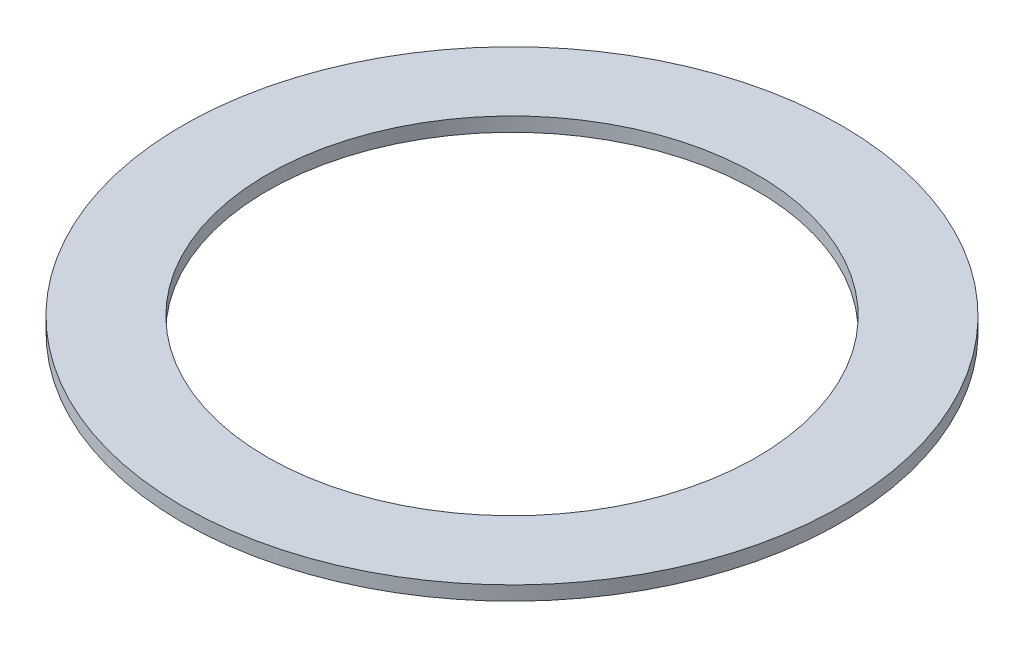
ISO-10303-21;
HEADER;
FILE_DESCRIPTION(('STEP AP214'),'2;1');
FILE_NAME('part.step','',(''),(''),'','','');
FILE_SCHEMA(('AUTOMOTIVE_DESIGN { 1 0 10303 214 1 1 1 1 }'));
ENDSEC;
DATA;
#1=APPLICATION_CONTEXT('core data for automotive mechanical design processes');
#2=APPLICATION_PROTOCOL_DEFINITION('international standard','automotive_design',2000,#1);
#3=PRODUCT_CONTEXT('',#1,'mechanical');
#4=PRODUCT('Part','Part','',(#3));
#5=PRODUCT_RELATED_PRODUCT_CATEGORY('part','',(#4));
#6=PRODUCT_DEFINITION_FORMATION('','',#4);
#7=PRODUCT_DEFINITION_CONTEXT('part definition',#1,'design');
#8=PRODUCT_DEFINITION('design','',#6,#7);
#9=PRODUCT_DEFINITION_SHAPE('','',#8);
#10=(LENGTH_UNIT() NAMED_UNIT(*) SI_UNIT(.MILLI.,.METRE.));
#11=(NAMED_UNIT(*) PLANE_ANGLE_UNIT() SI_UNIT($,.RADIAN.));
#12=(NAMED_UNIT(*) SI_UNIT($,.STERADIAN.) SOLID_ANGLE_UNIT());
#13=UNCERTAINTY_MEASURE_WITH_UNIT(LENGTH_MEASURE(1.E-05),#10,'distance_accuracy_value','');
#14=(GEOMETRIC_REPRESENTATION_CONTEXT(3) GLOBAL_UNCERTAINTY_ASSIGNED_CONTEXT((#13)) GLOBAL_UNIT_ASSIGNED_CONTEXT((#10,
#11,#12)) REPRESENTATION_CONTEXT('',''));
#15=CARTESIAN_POINT('',(0.,0.,0.));
#16=DIRECTION('',(0.,0.,1.));
#17=DIRECTION('',(1.,0.,0.));
#18=AXIS2_PLACEMENT_3D('',#15,#16,#17);
#19=CARTESIAN_POINT('',(0.,0.75,0.));
#20=DIRECTION('',(0.,1.,0.));
#21=DIRECTION('',(0.,0.,1.));
#22=AXIS2_PLACEMENT_3D('',#19,#20,#21);
#23=PLANE('',#22);
#24=CARTESIAN_POINT('',(0.,0.75,0.));
#25=DIRECTION('',(0.,1.,0.));
#26=DIRECTION('',(0.,0.,1.));
#27=AXIS2_PLACEMENT_3D('',#24,#25,#26);
#28=CIRCLE('',#27,17.5);
#29=CARTESIAN_POINT('',(0.,0.75,17.5));
#30=VERTEX_POINT('',#29);
#31=EDGE_CURVE('E10',#30,#30,#28,.T.);
#32=ORIENTED_EDGE('',*,*,#31,.T.);
#33=EDGE_LOOP('',(#32));
#34=FACE_BOUND('',#33,.T.);
#35=CARTESIAN_POINT('',(0.,0.75,0.));
#36=DIRECTION('',(0.,1.,0.));
#37=DIRECTION('',(0.,0.,1.));
#38=AXIS2_PLACEMENT_3D('',#35,#36,#37);
#39=CIRCLE('',#38,13.);
#40=CARTESIAN_POINT('',(0.,0.75,13.));
#41=VERTEX_POINT('',#40);
#42=EDGE_CURVE('E50',#41,#41,#39,.T.);
#43=ORIENTED_EDGE('',*,*,#42,.F.);
#44=EDGE_LOOP('',(#43));
#45=FACE_BOUND('',#44,.T.);
#46=ADVANCED_FACE('F37',(#34,#45),#23,.T.);
#47=CARTESIAN_POINT('',(0.,0.,0.));
#48=DIRECTION('',(0.,1.,0.));
#49=DIRECTION('',(0.,0.,1.));
#50=AXIS2_PLACEMENT_3D('',#47,#48,#49);
#51=PLANE('',#50);
#52=CARTESIAN_POINT('',(0.,0.,0.));
#53=DIRECTION('',(0.,1.,0.));
#54=DIRECTION('',(0.,0.,1.));
#55=AXIS2_PLACEMENT_3D('',#52,#53,#54);
#56=CIRCLE('',#55,17.5);
#57=CARTESIAN_POINT('',(0.,0.,17.5));
#58=VERTEX_POINT('',#57);
#59=EDGE_CURVE('E41',#58,#58,#56,.T.);
#60=ORIENTED_EDGE('',*,*,#59,.F.);
#61=EDGE_LOOP('',(#60));
#62=FACE_BOUND('',#61,.T.);
#63=CARTESIAN_POINT('',(0.,0.,0.));
#64=DIRECTION('',(0.,1.,0.));
#65=DIRECTION('',(0.,0.,1.));
#66=AXIS2_PLACEMENT_3D('',#63,#64,#65);
#67=CIRCLE('',#66,13.);
#68=CARTESIAN_POINT('',(0.,0.,13.));
#69=VERTEX_POINT('',#68);
#70=EDGE_CURVE('E52',#69,#69,#67,.T.);
#71=ORIENTED_EDGE('',*,*,#70,.T.);
#72=EDGE_LOOP('',(#71));
#73=FACE_BOUND('',#72,.T.);
#74=ADVANCED_FACE('F64',(#62,#73),#51,.F.);
#75=CARTESIAN_POINT('',(0.,0.75,0.));
#76=DIRECTION('',(0.,-1.,0.));
#77=DIRECTION('',(0.,0.,-1.));
#78=AXIS2_PLACEMENT_3D('',#75,#76,#77);
#79=CYLINDRICAL_SURFACE('',#78,17.5);
#80=ORIENTED_EDGE('',*,*,#31,.F.);
#81=EDGE_LOOP('',(#80));
#82=FACE_BOUND('',#81,.T.);
#83=ORIENTED_EDGE('',*,*,#59,.T.);
#84=EDGE_LOOP('',(#83));
#85=FACE_BOUND('',#84,.T.);
#86=ADVANCED_FACE('F39',(#82,#85),#79,.T.);
#87=CARTESIAN_POINT('',(0.,0.75,0.));
#88=DIRECTION('',(0.,-1.,0.));
#89=DIRECTION('',(0.,0.,-1.));
#90=AXIS2_PLACEMENT_3D('',#87,#88,#89);
#91=CYLINDRICAL_SURFACE('',#90,13.);
#92=ORIENTED_EDGE('',*,*,#42,.T.);
#93=EDGE_LOOP('',(#92));
#94=FACE_BOUND('',#93,.T.);
#95=ORIENTED_EDGE('',*,*,#70,.F.);
#96=EDGE_LOOP('',(#95));
#97=FACE_BOUND('',#96,.T.);
#98=ADVANCED_FACE('F60',(#94,#97),#91,.F.);
#99=CLOSED_SHELL('',(#46,#74,#86,#98));
#100=MANIFOLD_SOLID_BREP('B2',#99);
#101=ADVANCED_BREP_SHAPE_REPRESENTATION('',(#18,#100),#14);
#102=SHAPE_DEFINITION_REPRESENTATION(#9,#101);
ENDSEC;
END-ISO-10303-21;
